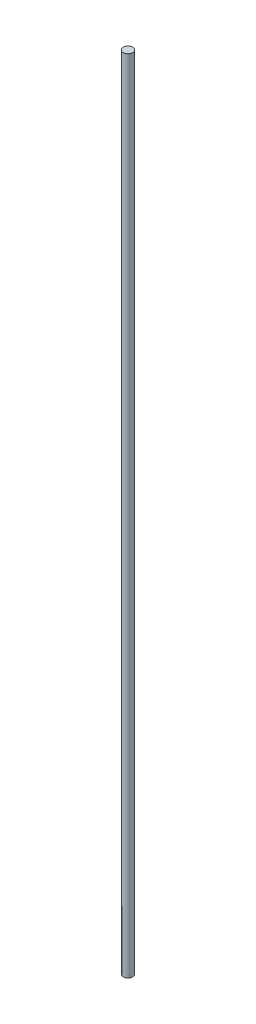
ISO-10303-21;
HEADER;
FILE_DESCRIPTION(('STEP AP214'),'2;1');
FILE_NAME('part.step','',(''),(''),'','','');
FILE_SCHEMA(('AUTOMOTIVE_DESIGN { 1 0 10303 214 1 1 1 1 }'));
ENDSEC;
DATA;
#1=APPLICATION_CONTEXT('core data for automotive mechanical design processes');
#2=APPLICATION_PROTOCOL_DEFINITION('international standard','automotive_design',2000,#1);
#3=PRODUCT_CONTEXT('',#1,'mechanical');
#4=PRODUCT('Part','Part','',(#3));
#5=PRODUCT_RELATED_PRODUCT_CATEGORY('part','',(#4));
#6=PRODUCT_DEFINITION_FORMATION('','',#4);
#7=PRODUCT_DEFINITION_CONTEXT('part definition',#1,'design');
#8=PRODUCT_DEFINITION('design','',#6,#7);
#9=PRODUCT_DEFINITION_SHAPE('','',#8);
#10=(LENGTH_UNIT() NAMED_UNIT(*) SI_UNIT(.MILLI.,.METRE.));
#11=(NAMED_UNIT(*) PLANE_ANGLE_UNIT() SI_UNIT($,.RADIAN.));
#12=(NAMED_UNIT(*) SI_UNIT($,.STERADIAN.) SOLID_ANGLE_UNIT());
#13=UNCERTAINTY_MEASURE_WITH_UNIT(LENGTH_MEASURE(1.E-05),#10,'distance_accuracy_value','');
#14=(GEOMETRIC_REPRESENTATION_CONTEXT(3) GLOBAL_UNCERTAINTY_ASSIGNED_CONTEXT((#13)) GLOBAL_UNIT_ASSIGNED_CONTEXT((#10,
#11,#12)) REPRESENTATION_CONTEXT('',''));
#15=CARTESIAN_POINT('',(0.,0.,0.));
#16=DIRECTION('',(0.,0.,1.));
#17=DIRECTION('',(1.,0.,0.));
#18=AXIS2_PLACEMENT_3D('',#15,#16,#17);
#19=CARTESIAN_POINT('',(0.,420.,0.));
#20=DIRECTION('',(0.,-1.,0.));
#21=DIRECTION('',(0.,0.,-1.));
#22=AXIS2_PLACEMENT_3D('',#19,#20,#21);
#23=CYLINDRICAL_SURFACE('',#22,2.5);
#24=CARTESIAN_POINT('',(0.,420.,0.));
#25=DIRECTION('',(0.,1.,0.));
#26=DIRECTION('',(0.,0.,1.));
#27=AXIS2_PLACEMENT_3D('',#24,#25,#26);
#28=CIRCLE('',#27,2.5);
#29=CARTESIAN_POINT('',(0.,420.,2.5));
#30=VERTEX_POINT('',#29);
#31=EDGE_CURVE('E10',#30,#30,#28,.T.);
#32=ORIENTED_EDGE('',*,*,#31,.F.);
#33=EDGE_LOOP('',(#32));
#34=FACE_BOUND('',#33,.T.);
#35=CARTESIAN_POINT('',(0.,0.,0.));
#36=DIRECTION('',(0.,1.,0.));
#37=DIRECTION('',(0.,0.,1.));
#38=AXIS2_PLACEMENT_3D('',#35,#36,#37);
#39=CIRCLE('',#38,2.5);
#40=CARTESIAN_POINT('',(0.,0.,2.5));
#41=VERTEX_POINT('',#40);
#42=EDGE_CURVE('E36',#41,#41,#39,.T.);
#43=ORIENTED_EDGE('',*,*,#42,.T.);
#44=EDGE_LOOP('',(#43));
#45=FACE_BOUND('',#44,.T.);
#46=ADVANCED_FACE('F33',(#34,#45),#23,.T.);
#47=CARTESIAN_POINT('',(0.,420.,0.));
#48=DIRECTION('',(0.,1.,0.));
#49=DIRECTION('',(0.,0.,1.));
#50=AXIS2_PLACEMENT_3D('',#47,#48,#49);
#51=PLANE('',#50);
#52=ORIENTED_EDGE('',*,*,#31,.T.);
#53=EDGE_LOOP('',(#52));
#54=FACE_BOUND('',#53,.T.);
#55=ADVANCED_FACE('F48',(#54),#51,.T.);
#56=CARTESIAN_POINT('',(0.,0.,0.));
#57=DIRECTION('',(0.,1.,0.));
#58=DIRECTION('',(0.,0.,1.));
#59=AXIS2_PLACEMENT_3D('',#56,#57,#58);
#60=PLANE('',#59);
#61=ORIENTED_EDGE('',*,*,#42,.F.);
#62=EDGE_LOOP('',(#61));
#63=FACE_BOUND('',#62,.T.);
#64=ADVANCED_FACE('F46',(#63),#60,.F.);
#65=CLOSED_SHELL('',(#46,#55,#64));
#66=MANIFOLD_SOLID_BREP('B2',#65);
#67=ADVANCED_BREP_SHAPE_REPRESENTATION('',(#18,#66),#14);
#68=SHAPE_DEFINITION_REPRESENTATION(#9,#67);
ENDSEC;
END-ISO-10303-21;
